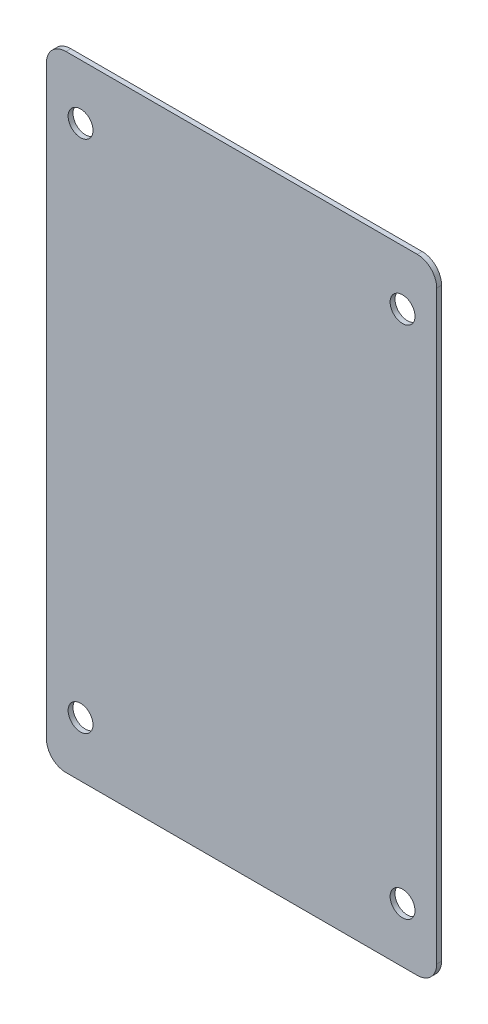
ISO-10303-21;
HEADER;
FILE_DESCRIPTION(('STEP AP214'),'2;1');
FILE_NAME('part.step','',(''),(''),'','','');
FILE_SCHEMA(('AUTOMOTIVE_DESIGN { 1 0 10303 214 1 1 1 1 }'));
ENDSEC;
DATA;
#1=APPLICATION_CONTEXT('core data for automotive mechanical design processes');
#2=APPLICATION_PROTOCOL_DEFINITION('international standard','automotive_design',2000,#1);
#3=PRODUCT_CONTEXT('',#1,'mechanical');
#4=PRODUCT('Part','Part','',(#3));
#5=PRODUCT_RELATED_PRODUCT_CATEGORY('part','',(#4));
#6=PRODUCT_DEFINITION_FORMATION('','',#4);
#7=PRODUCT_DEFINITION_CONTEXT('part definition',#1,'design');
#8=PRODUCT_DEFINITION('design','',#6,#7);
#9=PRODUCT_DEFINITION_SHAPE('','',#8);
#10=(LENGTH_UNIT() NAMED_UNIT(*) SI_UNIT(.MILLI.,.METRE.));
#11=(NAMED_UNIT(*) PLANE_ANGLE_UNIT() SI_UNIT($,.RADIAN.));
#12=(NAMED_UNIT(*) SI_UNIT($,.STERADIAN.) SOLID_ANGLE_UNIT());
#13=UNCERTAINTY_MEASURE_WITH_UNIT(LENGTH_MEASURE(1.E-05),#10,'distance_accuracy_value','');
#14=(GEOMETRIC_REPRESENTATION_CONTEXT(3) GLOBAL_UNCERTAINTY_ASSIGNED_CONTEXT((#13)) GLOBAL_UNIT_ASSIGNED_CONTEXT((#10,
#11,#12)) REPRESENTATION_CONTEXT('',''));
#15=CARTESIAN_POINT('',(0.,0.,0.));
#16=DIRECTION('',(0.,0.,1.));
#17=DIRECTION('',(1.,0.,0.));
#18=AXIS2_PLACEMENT_3D('',#15,#16,#17);
#19=CARTESIAN_POINT('',(40.,-64.,1.));
#20=DIRECTION('',(-1.,0.,0.));
#21=DIRECTION('',(0.,0.,1.));
#22=AXIS2_PLACEMENT_3D('',#19,#20,#21);
#23=PLANE('',#22);
#24=DIRECTION('',(0.,1.,0.));
#25=VECTOR('',#24,1.);
#26=CARTESIAN_POINT('',(40.,-64.,1.));
#27=LINE('',#26,#25);
#28=CARTESIAN_POINT('',(40.,-60.,1.));
#29=VERTEX_POINT('',#28);
#30=CARTESIAN_POINT('',(40.,60.,1.));
#31=VERTEX_POINT('',#30);
#32=EDGE_CURVE('E130',#29,#31,#27,.T.);
#33=ORIENTED_EDGE('',*,*,#32,.F.);
#34=DIRECTION('',(0.,0.,-1.));
#35=VECTOR('',#34,1.);
#36=CARTESIAN_POINT('',(40.,-60.,1.));
#37=LINE('',#36,#35);
#38=CARTESIAN_POINT('',(40.,-60.,0.));
#39=VERTEX_POINT('',#38);
#40=EDGE_CURVE('E11',#29,#39,#37,.T.);
#41=ORIENTED_EDGE('',*,*,#40,.T.);
#42=DIRECTION('',(0.,1.,0.));
#43=VECTOR('',#42,1.);
#44=CARTESIAN_POINT('',(40.,-64.,0.));
#45=LINE('',#44,#43);
#46=CARTESIAN_POINT('',(40.,60.,0.));
#47=VERTEX_POINT('',#46);
#48=EDGE_CURVE('E132',#39,#47,#45,.T.);
#49=ORIENTED_EDGE('',*,*,#48,.T.);
#50=DIRECTION('',(0.,0.,-1.));
#51=VECTOR('',#50,1.);
#52=CARTESIAN_POINT('',(40.,60.,1.));
#53=LINE('',#52,#51);
#54=EDGE_CURVE('E43',#47,#31,#53,.F.);
#55=ORIENTED_EDGE('',*,*,#54,.T.);
#56=EDGE_LOOP('',(#33,#41,#49,#55));
#57=FACE_BOUND('',#56,.T.);
#58=ADVANCED_FACE('F35',(#57),#23,.F.);
#59=CARTESIAN_POINT('',(-40.,64.,1.));
#60=DIRECTION('',(0.,-1.,0.));
#61=DIRECTION('',(0.,0.,-1.));
#62=AXIS2_PLACEMENT_3D('',#59,#60,#61);
#63=PLANE('',#62);
#64=DIRECTION('',(-1.,0.,0.));
#65=VECTOR('',#64,1.);
#66=CARTESIAN_POINT('',(-40.,64.,0.));
#67=LINE('',#66,#65);
#68=CARTESIAN_POINT('',(36.,64.,0.));
#69=VERTEX_POINT('',#68);
#70=CARTESIAN_POINT('',(-36.,64.,0.));
#71=VERTEX_POINT('',#70);
#72=EDGE_CURVE('E128',#69,#71,#67,.T.);
#73=ORIENTED_EDGE('',*,*,#72,.T.);
#74=DIRECTION('',(0.,0.,-1.));
#75=VECTOR('',#74,1.);
#76=CARTESIAN_POINT('',(-36.,64.,1.));
#77=LINE('',#76,#75);
#78=CARTESIAN_POINT('',(-36.,64.,1.));
#79=VERTEX_POINT('',#78);
#80=EDGE_CURVE('E107',#71,#79,#77,.F.);
#81=ORIENTED_EDGE('',*,*,#80,.T.);
#82=DIRECTION('',(-1.,0.,0.));
#83=VECTOR('',#82,1.);
#84=CARTESIAN_POINT('',(-40.,64.,1.));
#85=LINE('',#84,#83);
#86=CARTESIAN_POINT('',(36.,64.,1.));
#87=VERTEX_POINT('',#86);
#88=EDGE_CURVE('E168',#87,#79,#85,.T.);
#89=ORIENTED_EDGE('',*,*,#88,.F.);
#90=DIRECTION('',(0.,0.,-1.));
#91=VECTOR('',#90,1.);
#92=CARTESIAN_POINT('',(36.,64.,1.));
#93=LINE('',#92,#91);
#94=EDGE_CURVE('E112',#87,#69,#93,.T.);
#95=ORIENTED_EDGE('',*,*,#94,.T.);
#96=EDGE_LOOP('',(#73,#81,#89,#95));
#97=FACE_BOUND('',#96,.T.);
#98=ADVANCED_FACE('F172',(#97),#63,.F.);
#99=CARTESIAN_POINT('',(-40.,-64.,1.));
#100=DIRECTION('',(1.,0.,0.));
#101=DIRECTION('',(0.,0.,-1.));
#102=AXIS2_PLACEMENT_3D('',#99,#100,#101);
#103=PLANE('',#102);
#104=DIRECTION('',(0.,-1.,0.));
#105=VECTOR('',#104,1.);
#106=CARTESIAN_POINT('',(-40.,-64.,1.));
#107=LINE('',#106,#105);
#108=CARTESIAN_POINT('',(-40.,60.,1.));
#109=VERTEX_POINT('',#108);
#110=CARTESIAN_POINT('',(-40.,-60.,1.));
#111=VERTEX_POINT('',#110);
#112=EDGE_CURVE('E121',#109,#111,#107,.T.);
#113=ORIENTED_EDGE('',*,*,#112,.F.);
#114=DIRECTION('',(0.,0.,-1.));
#115=VECTOR('',#114,1.);
#116=CARTESIAN_POINT('',(-40.,60.,1.));
#117=LINE('',#116,#115);
#118=CARTESIAN_POINT('',(-40.,60.,0.));
#119=VERTEX_POINT('',#118);
#120=EDGE_CURVE('E106',#109,#119,#117,.T.);
#121=ORIENTED_EDGE('',*,*,#120,.T.);
#122=DIRECTION('',(0.,-1.,0.));
#123=VECTOR('',#122,1.);
#124=CARTESIAN_POINT('',(-40.,-64.,0.));
#125=LINE('',#124,#123);
#126=CARTESIAN_POINT('',(-40.,-60.,0.));
#127=VERTEX_POINT('',#126);
#128=EDGE_CURVE('E119',#119,#127,#125,.T.);
#129=ORIENTED_EDGE('',*,*,#128,.T.);
#130=DIRECTION('',(0.,0.,-1.));
#131=VECTOR('',#130,1.);
#132=CARTESIAN_POINT('',(-40.,-60.,1.));
#133=LINE('',#132,#131);
#134=EDGE_CURVE('E123',#127,#111,#133,.F.);
#135=ORIENTED_EDGE('',*,*,#134,.T.);
#136=EDGE_LOOP('',(#113,#121,#129,#135));
#137=FACE_BOUND('',#136,.T.);
#138=ADVANCED_FACE('F118',(#137),#103,.F.);
#139=CARTESIAN_POINT('',(-40.,-64.,1.));
#140=DIRECTION('',(0.,1.,0.));
#141=DIRECTION('',(0.,0.,1.));
#142=AXIS2_PLACEMENT_3D('',#139,#140,#141);
#143=PLANE('',#142);
#144=DIRECTION('',(1.,0.,0.));
#145=VECTOR('',#144,1.);
#146=CARTESIAN_POINT('',(-40.,-64.,1.));
#147=LINE('',#146,#145);
#148=CARTESIAN_POINT('',(-36.,-64.,1.));
#149=VERTEX_POINT('',#148);
#150=CARTESIAN_POINT('',(36.,-64.,1.));
#151=VERTEX_POINT('',#150);
#152=EDGE_CURVE('E136',#149,#151,#147,.T.);
#153=ORIENTED_EDGE('',*,*,#152,.F.);
#154=DIRECTION('',(0.,0.,-1.));
#155=VECTOR('',#154,1.);
#156=CARTESIAN_POINT('',(-36.,-64.,1.));
#157=LINE('',#156,#155);
#158=CARTESIAN_POINT('',(-36.,-64.,0.));
#159=VERTEX_POINT('',#158);
#160=EDGE_CURVE('E153',#149,#159,#157,.T.);
#161=ORIENTED_EDGE('',*,*,#160,.T.);
#162=DIRECTION('',(1.,0.,0.));
#163=VECTOR('',#162,1.);
#164=CARTESIAN_POINT('',(-40.,-64.,0.));
#165=LINE('',#164,#163);
#166=CARTESIAN_POINT('',(36.,-64.,0.));
#167=VERTEX_POINT('',#166);
#168=EDGE_CURVE('E127',#159,#167,#165,.T.);
#169=ORIENTED_EDGE('',*,*,#168,.T.);
#170=DIRECTION('',(0.,0.,-1.));
#171=VECTOR('',#170,1.);
#172=CARTESIAN_POINT('',(36.,-64.,1.));
#173=LINE('',#172,#171);
#174=EDGE_CURVE('E50',#167,#151,#173,.F.);
#175=ORIENTED_EDGE('',*,*,#174,.T.);
#176=EDGE_LOOP('',(#153,#161,#169,#175));
#177=FACE_BOUND('',#176,.T.);
#178=ADVANCED_FACE('F261',(#177),#143,.F.);
#179=CARTESIAN_POINT('',(0.,0.,1.));
#180=DIRECTION('',(0.,0.,-1.));
#181=DIRECTION('',(-1.,0.,0.));
#182=AXIS2_PLACEMENT_3D('',#179,#180,#181);
#183=PLANE('',#182);
#184=CARTESIAN_POINT('',(-33.,-52.7499999999999,1.));
#185=DIRECTION('',(0.,0.,-1.));
#186=DIRECTION('',(-1.,0.,0.));
#187=AXIS2_PLACEMENT_3D('',#184,#185,#186);
#188=CIRCLE('',#187,2.55);
#189=CARTESIAN_POINT('',(-35.55,-52.7499999999999,1.));
#190=VERTEX_POINT('',#189);
#191=EDGE_CURVE('E187',#190,#190,#188,.T.);
#192=ORIENTED_EDGE('',*,*,#191,.T.);
#193=EDGE_LOOP('',(#192));
#194=FACE_BOUND('',#193,.T.);
#195=CARTESIAN_POINT('',(-32.9999999999996,52.7500000000001,1.));
#196=DIRECTION('',(0.,0.,-1.));
#197=DIRECTION('',(-1.,0.,0.));
#198=AXIS2_PLACEMENT_3D('',#195,#196,#197);
#199=CIRCLE('',#198,2.55);
#200=CARTESIAN_POINT('',(-35.5499999999996,52.7500000000001,1.));
#201=VERTEX_POINT('',#200);
#202=EDGE_CURVE('E193',#201,#201,#199,.T.);
#203=ORIENTED_EDGE('',*,*,#202,.T.);
#204=EDGE_LOOP('',(#203));
#205=FACE_BOUND('',#204,.T.);
#206=CARTESIAN_POINT('',(33.0000000000004,52.7499999999999,1.));
#207=DIRECTION('',(0.,0.,-1.));
#208=DIRECTION('',(-1.,0.,0.));
#209=AXIS2_PLACEMENT_3D('',#206,#207,#208);
#210=CIRCLE('',#209,2.55);
#211=CARTESIAN_POINT('',(30.4500000000004,52.7499999999999,1.));
#212=VERTEX_POINT('',#211);
#213=EDGE_CURVE('E182',#212,#212,#210,.T.);
#214=ORIENTED_EDGE('',*,*,#213,.T.);
#215=EDGE_LOOP('',(#214));
#216=FACE_BOUND('',#215,.T.);
#217=CARTESIAN_POINT('',(33.,-52.7500000000001,1.));
#218=DIRECTION('',(0.,0.,-1.));
#219=DIRECTION('',(-1.,0.,0.));
#220=AXIS2_PLACEMENT_3D('',#217,#218,#219);
#221=CIRCLE('',#220,2.55);
#222=CARTESIAN_POINT('',(30.45,-52.7500000000001,1.));
#223=VERTEX_POINT('',#222);
#224=EDGE_CURVE('E173',#223,#223,#221,.T.);
#225=ORIENTED_EDGE('',*,*,#224,.T.);
#226=EDGE_LOOP('',(#225));
#227=FACE_BOUND('',#226,.T.);
#228=ORIENTED_EDGE('',*,*,#88,.T.);
#229=CARTESIAN_POINT('',(-36.,60.,1.));
#230=DIRECTION('',(0.,0.,-1.));
#231=DIRECTION('',(-1.,0.,0.));
#232=AXIS2_PLACEMENT_3D('',#229,#230,#231);
#233=CIRCLE('',#232,4.);
#234=EDGE_CURVE('E150',#79,#109,#233,.F.);
#235=ORIENTED_EDGE('',*,*,#234,.T.);
#236=ORIENTED_EDGE('',*,*,#112,.T.);
#237=CARTESIAN_POINT('',(-36.,-60.,1.));
#238=DIRECTION('',(0.,0.,-1.));
#239=DIRECTION('',(-1.,0.,0.));
#240=AXIS2_PLACEMENT_3D('',#237,#238,#239);
#241=CIRCLE('',#240,4.);
#242=EDGE_CURVE('E57',#111,#149,#241,.F.);
#243=ORIENTED_EDGE('',*,*,#242,.T.);
#244=ORIENTED_EDGE('',*,*,#152,.T.);
#245=CARTESIAN_POINT('',(36.,-60.,1.));
#246=DIRECTION('',(0.,0.,-1.));
#247=DIRECTION('',(-1.,0.,0.));
#248=AXIS2_PLACEMENT_3D('',#245,#246,#247);
#249=CIRCLE('',#248,4.);
#250=EDGE_CURVE('E147',#151,#29,#249,.F.);
#251=ORIENTED_EDGE('',*,*,#250,.T.);
#252=ORIENTED_EDGE('',*,*,#32,.T.);
#253=CARTESIAN_POINT('',(36.,60.,1.));
#254=DIRECTION('',(0.,0.,-1.));
#255=DIRECTION('',(-1.,0.,0.));
#256=AXIS2_PLACEMENT_3D('',#253,#254,#255);
#257=CIRCLE('',#256,4.);
#258=EDGE_CURVE('E145',#31,#87,#257,.F.);
#259=ORIENTED_EDGE('',*,*,#258,.T.);
#260=EDGE_LOOP('',(#228,#235,#236,#243,#244,#251,#252,#259));
#261=FACE_BOUND('',#260,.T.);
#262=ADVANCED_FACE('F165',(#194,#205,#216,#227,#261),#183,.F.);
#263=CARTESIAN_POINT('',(0.,0.,0.));
#264=DIRECTION('',(0.,0.,-1.));
#265=DIRECTION('',(-1.,0.,0.));
#266=AXIS2_PLACEMENT_3D('',#263,#264,#265);
#267=PLANE('',#266);
#268=CARTESIAN_POINT('',(-33.,-52.7499999999999,0.));
#269=DIRECTION('',(0.,0.,-1.));
#270=DIRECTION('',(-1.,0.,0.));
#271=AXIS2_PLACEMENT_3D('',#268,#269,#270);
#272=CIRCLE('',#271,2.55);
#273=CARTESIAN_POINT('',(-35.55,-52.7499999999999,0.));
#274=VERTEX_POINT('',#273);
#275=EDGE_CURVE('E184',#274,#274,#272,.T.);
#276=ORIENTED_EDGE('',*,*,#275,.F.);
#277=EDGE_LOOP('',(#276));
#278=FACE_BOUND('',#277,.T.);
#279=CARTESIAN_POINT('',(-32.9999999999996,52.7500000000001,0.));
#280=DIRECTION('',(0.,0.,-1.));
#281=DIRECTION('',(-1.,0.,0.));
#282=AXIS2_PLACEMENT_3D('',#279,#280,#281);
#283=CIRCLE('',#282,2.55);
#284=CARTESIAN_POINT('',(-35.5499999999996,52.7500000000001,0.));
#285=VERTEX_POINT('',#284);
#286=EDGE_CURVE('E190',#285,#285,#283,.T.);
#287=ORIENTED_EDGE('',*,*,#286,.F.);
#288=EDGE_LOOP('',(#287));
#289=FACE_BOUND('',#288,.T.);
#290=CARTESIAN_POINT('',(33.0000000000004,52.7499999999999,0.));
#291=DIRECTION('',(0.,0.,-1.));
#292=DIRECTION('',(-1.,0.,0.));
#293=AXIS2_PLACEMENT_3D('',#290,#291,#292);
#294=CIRCLE('',#293,2.55);
#295=CARTESIAN_POINT('',(30.4500000000004,52.7499999999999,0.));
#296=VERTEX_POINT('',#295);
#297=EDGE_CURVE('E196',#296,#296,#294,.T.);
#298=ORIENTED_EDGE('',*,*,#297,.F.);
#299=EDGE_LOOP('',(#298));
#300=FACE_BOUND('',#299,.T.);
#301=CARTESIAN_POINT('',(33.,-52.7500000000001,0.));
#302=DIRECTION('',(0.,0.,-1.));
#303=DIRECTION('',(-1.,0.,0.));
#304=AXIS2_PLACEMENT_3D('',#301,#302,#303);
#305=CIRCLE('',#304,2.55);
#306=CARTESIAN_POINT('',(30.45,-52.7500000000001,0.));
#307=VERTEX_POINT('',#306);
#308=EDGE_CURVE('E175',#307,#307,#305,.T.);
#309=ORIENTED_EDGE('',*,*,#308,.F.);
#310=EDGE_LOOP('',(#309));
#311=FACE_BOUND('',#310,.T.);
#312=ORIENTED_EDGE('',*,*,#128,.F.);
#313=CARTESIAN_POINT('',(-36.,60.,0.));
#314=DIRECTION('',(0.,0.,-1.));
#315=DIRECTION('',(-1.,0.,0.));
#316=AXIS2_PLACEMENT_3D('',#313,#314,#315);
#317=CIRCLE('',#316,4.);
#318=EDGE_CURVE('E102',#119,#71,#317,.T.);
#319=ORIENTED_EDGE('',*,*,#318,.T.);
#320=ORIENTED_EDGE('',*,*,#72,.F.);
#321=CARTESIAN_POINT('',(36.,60.,0.));
#322=DIRECTION('',(0.,0.,-1.));
#323=DIRECTION('',(-1.,0.,0.));
#324=AXIS2_PLACEMENT_3D('',#321,#322,#323);
#325=CIRCLE('',#324,4.);
#326=EDGE_CURVE('E122',#69,#47,#325,.T.);
#327=ORIENTED_EDGE('',*,*,#326,.T.);
#328=ORIENTED_EDGE('',*,*,#48,.F.);
#329=CARTESIAN_POINT('',(36.,-60.,0.));
#330=DIRECTION('',(0.,0.,-1.));
#331=DIRECTION('',(-1.,0.,0.));
#332=AXIS2_PLACEMENT_3D('',#329,#330,#331);
#333=CIRCLE('',#332,4.);
#334=EDGE_CURVE('E139',#39,#167,#333,.T.);
#335=ORIENTED_EDGE('',*,*,#334,.T.);
#336=ORIENTED_EDGE('',*,*,#168,.F.);
#337=CARTESIAN_POINT('',(-36.,-60.,0.));
#338=DIRECTION('',(0.,0.,-1.));
#339=DIRECTION('',(-1.,0.,0.));
#340=AXIS2_PLACEMENT_3D('',#337,#338,#339);
#341=CIRCLE('',#340,4.);
#342=EDGE_CURVE('E113',#159,#127,#341,.T.);
#343=ORIENTED_EDGE('',*,*,#342,.T.);
#344=EDGE_LOOP('',(#312,#319,#320,#327,#328,#335,#336,#343));
#345=FACE_BOUND('',#344,.T.);
#346=ADVANCED_FACE('F125',(#278,#289,#300,#311,#345),#267,.T.);
#347=CARTESIAN_POINT('',(-36.,60.,1.));
#348=DIRECTION('',(0.,0.,-1.));
#349=DIRECTION('',(-1.,0.,0.));
#350=AXIS2_PLACEMENT_3D('',#347,#348,#349);
#351=CYLINDRICAL_SURFACE('',#350,4.);
#352=ORIENTED_EDGE('',*,*,#234,.F.);
#353=ORIENTED_EDGE('',*,*,#80,.F.);
#354=ORIENTED_EDGE('',*,*,#318,.F.);
#355=ORIENTED_EDGE('',*,*,#120,.F.);
#356=EDGE_LOOP('',(#352,#353,#354,#355));
#357=FACE_BOUND('',#356,.T.);
#358=ADVANCED_FACE('F105',(#357),#351,.T.);
#359=CARTESIAN_POINT('',(-36.,-60.,1.));
#360=DIRECTION('',(0.,0.,-1.));
#361=DIRECTION('',(-1.,0.,0.));
#362=AXIS2_PLACEMENT_3D('',#359,#360,#361);
#363=CYLINDRICAL_SURFACE('',#362,4.);
#364=ORIENTED_EDGE('',*,*,#242,.F.);
#365=ORIENTED_EDGE('',*,*,#134,.F.);
#366=ORIENTED_EDGE('',*,*,#342,.F.);
#367=ORIENTED_EDGE('',*,*,#160,.F.);
#368=EDGE_LOOP('',(#364,#365,#366,#367));
#369=FACE_BOUND('',#368,.T.);
#370=ADVANCED_FACE('F238',(#369),#363,.T.);
#371=CARTESIAN_POINT('',(36.,-60.,1.));
#372=DIRECTION('',(0.,0.,-1.));
#373=DIRECTION('',(-1.,0.,0.));
#374=AXIS2_PLACEMENT_3D('',#371,#372,#373);
#375=CYLINDRICAL_SURFACE('',#374,4.);
#376=ORIENTED_EDGE('',*,*,#250,.F.);
#377=ORIENTED_EDGE('',*,*,#174,.F.);
#378=ORIENTED_EDGE('',*,*,#334,.F.);
#379=ORIENTED_EDGE('',*,*,#40,.F.);
#380=EDGE_LOOP('',(#376,#377,#378,#379));
#381=FACE_BOUND('',#380,.T.);
#382=ADVANCED_FACE('F224',(#381),#375,.T.);
#383=CARTESIAN_POINT('',(36.,60.,1.));
#384=DIRECTION('',(0.,0.,-1.));
#385=DIRECTION('',(-1.,0.,0.));
#386=AXIS2_PLACEMENT_3D('',#383,#384,#385);
#387=CYLINDRICAL_SURFACE('',#386,4.);
#388=ORIENTED_EDGE('',*,*,#258,.F.);
#389=ORIENTED_EDGE('',*,*,#54,.F.);
#390=ORIENTED_EDGE('',*,*,#326,.F.);
#391=ORIENTED_EDGE('',*,*,#94,.F.);
#392=EDGE_LOOP('',(#388,#389,#390,#391));
#393=FACE_BOUND('',#392,.T.);
#394=ADVANCED_FACE('F37',(#393),#387,.T.);
#395=CARTESIAN_POINT('',(33.,-52.7500000000001,1.));
#396=DIRECTION('',(0.,0.,-1.));
#397=DIRECTION('',(-1.,0.,0.));
#398=AXIS2_PLACEMENT_3D('',#395,#396,#397);
#399=CYLINDRICAL_SURFACE('',#398,2.55);
#400=ORIENTED_EDGE('',*,*,#224,.F.);
#401=EDGE_LOOP('',(#400));
#402=FACE_BOUND('',#401,.T.);
#403=ORIENTED_EDGE('',*,*,#308,.T.);
#404=EDGE_LOOP('',(#403));
#405=FACE_BOUND('',#404,.T.);
#406=ADVANCED_FACE('F208',(#402,#405),#399,.F.);
#407=CARTESIAN_POINT('',(33.0000000000004,52.7499999999999,1.));
#408=DIRECTION('',(0.,0.,-1.));
#409=DIRECTION('',(-1.,0.,0.));
#410=AXIS2_PLACEMENT_3D('',#407,#408,#409);
#411=CYLINDRICAL_SURFACE('',#410,2.55);
#412=ORIENTED_EDGE('',*,*,#213,.F.);
#413=EDGE_LOOP('',(#412));
#414=FACE_BOUND('',#413,.T.);
#415=ORIENTED_EDGE('',*,*,#297,.T.);
#416=EDGE_LOOP('',(#415));
#417=FACE_BOUND('',#416,.T.);
#418=ADVANCED_FACE('F204',(#414,#417),#411,.F.);
#419=CARTESIAN_POINT('',(-32.9999999999996,52.7500000000001,1.));
#420=DIRECTION('',(0.,0.,-1.));
#421=DIRECTION('',(-1.,0.,0.));
#422=AXIS2_PLACEMENT_3D('',#419,#420,#421);
#423=CYLINDRICAL_SURFACE('',#422,2.55);
#424=ORIENTED_EDGE('',*,*,#202,.F.);
#425=EDGE_LOOP('',(#424));
#426=FACE_BOUND('',#425,.T.);
#427=ORIENTED_EDGE('',*,*,#286,.T.);
#428=EDGE_LOOP('',(#427));
#429=FACE_BOUND('',#428,.T.);
#430=ADVANCED_FACE('F207',(#426,#429),#423,.F.);
#431=CARTESIAN_POINT('',(-33.,-52.7499999999999,1.));
#432=DIRECTION('',(0.,0.,-1.));
#433=DIRECTION('',(-1.,0.,0.));
#434=AXIS2_PLACEMENT_3D('',#431,#432,#433);
#435=CYLINDRICAL_SURFACE('',#434,2.55);
#436=ORIENTED_EDGE('',*,*,#191,.F.);
#437=EDGE_LOOP('',(#436));
#438=FACE_BOUND('',#437,.T.);
#439=ORIENTED_EDGE('',*,*,#275,.T.);
#440=EDGE_LOOP('',(#439));
#441=FACE_BOUND('',#440,.T.);
#442=ADVANCED_FACE('F288',(#438,#441),#435,.F.);
#443=CLOSED_SHELL('',(#58,#98,#138,#178,#262,#346,#358,#370,#382,#394,#406,#418,#430,#442));
#444=MANIFOLD_SOLID_BREP('B2',#443);
#445=ADVANCED_BREP_SHAPE_REPRESENTATION('',(#18,#444),#14);
#446=SHAPE_DEFINITION_REPRESENTATION(#9,#445);
ENDSEC;
END-ISO-10303-21;
